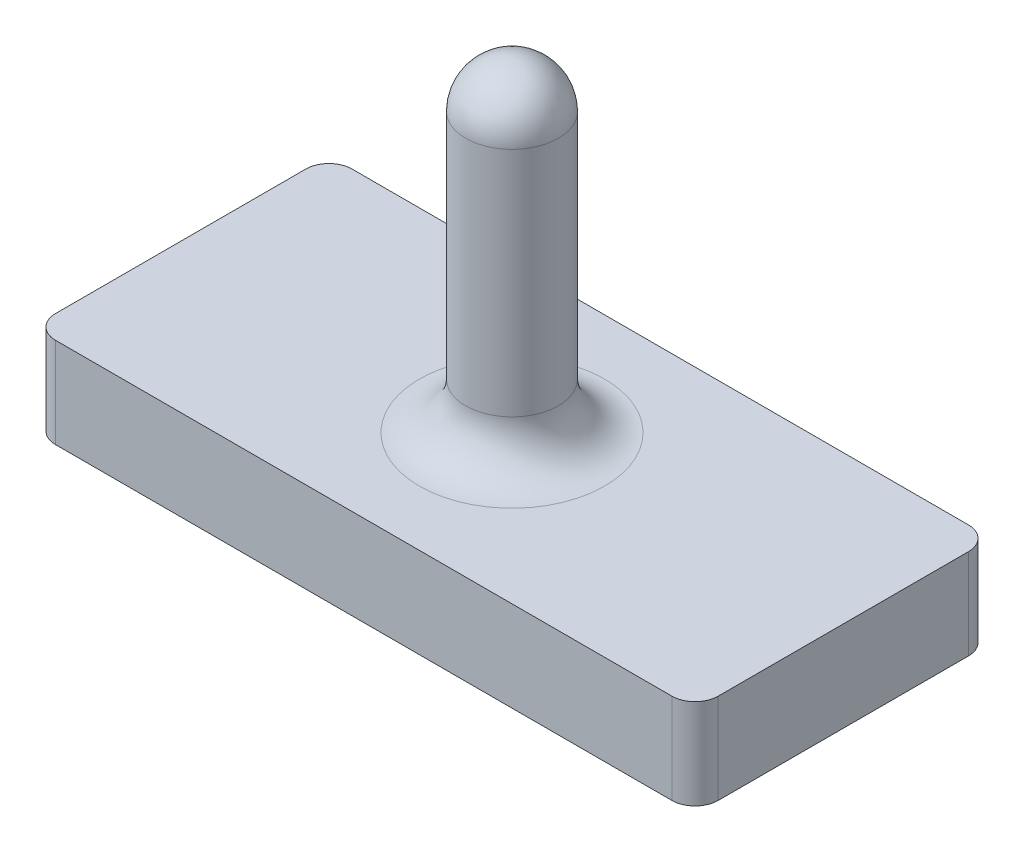
ISO-10303-21;
HEADER;
FILE_DESCRIPTION(('STEP AP214'),'2;1');
FILE_NAME('part.step','',(''),(''),'','','');
FILE_SCHEMA(('AUTOMOTIVE_DESIGN { 1 0 10303 214 1 1 1 1 }'));
ENDSEC;
DATA;
#1=APPLICATION_CONTEXT('core data for automotive mechanical design processes');
#2=APPLICATION_PROTOCOL_DEFINITION('international standard','automotive_design',2000,#1);
#3=PRODUCT_CONTEXT('',#1,'mechanical');
#4=PRODUCT('Part','Part','',(#3));
#5=PRODUCT_RELATED_PRODUCT_CATEGORY('part','',(#4));
#6=PRODUCT_DEFINITION_FORMATION('','',#4);
#7=PRODUCT_DEFINITION_CONTEXT('part definition',#1,'design');
#8=PRODUCT_DEFINITION('design','',#6,#7);
#9=PRODUCT_DEFINITION_SHAPE('','',#8);
#10=(LENGTH_UNIT() NAMED_UNIT(*) SI_UNIT(.MILLI.,.METRE.));
#11=(NAMED_UNIT(*) PLANE_ANGLE_UNIT() SI_UNIT($,.RADIAN.));
#12=(NAMED_UNIT(*) SI_UNIT($,.STERADIAN.) SOLID_ANGLE_UNIT());
#13=UNCERTAINTY_MEASURE_WITH_UNIT(LENGTH_MEASURE(1.E-05),#10,'distance_accuracy_value','');
#14=(GEOMETRIC_REPRESENTATION_CONTEXT(3) GLOBAL_UNCERTAINTY_ASSIGNED_CONTEXT((#13)) GLOBAL_UNIT_ASSIGNED_CONTEXT((#10,
#11,#12)) REPRESENTATION_CONTEXT('',''));
#15=CARTESIAN_POINT('',(0.,0.,0.));
#16=DIRECTION('',(0.,0.,1.));
#17=DIRECTION('',(1.,0.,0.));
#18=AXIS2_PLACEMENT_3D('',#15,#16,#17);
#19=CARTESIAN_POINT('',(0.,4.953,0.));
#20=DIRECTION('',(1.,0.,0.));
#21=DIRECTION('',(0.,0.,-1.));
#22=AXIS2_PLACEMENT_3D('',#19,#20,#21);
#23=PLANE('',#22);
#24=DIRECTION('',(0.,0.,1.));
#25=VECTOR('',#24,1.);
#26=CARTESIAN_POINT('',(0.,4.953,0.));
#27=LINE('',#26,#25);
#28=CARTESIAN_POINT('',(0.,4.953,1.27));
#29=VERTEX_POINT('',#28);
#30=CARTESIAN_POINT('',(0.,4.953,14.986));
#31=VERTEX_POINT('',#30);
#32=EDGE_CURVE('E137',#29,#31,#27,.T.);
#33=ORIENTED_EDGE('',*,*,#32,.F.);
#34=DIRECTION('',(0.,-1.,0.));
#35=VECTOR('',#34,1.);
#36=CARTESIAN_POINT('',(0.,4.953,1.27));
#37=LINE('',#36,#35);
#38=CARTESIAN_POINT('',(0.,0.,1.27));
#39=VERTEX_POINT('',#38);
#40=EDGE_CURVE('E11',#29,#39,#37,.T.);
#41=ORIENTED_EDGE('',*,*,#40,.T.);
#42=DIRECTION('',(0.,0.,1.));
#43=VECTOR('',#42,1.);
#44=CARTESIAN_POINT('',(0.,0.,0.));
#45=LINE('',#44,#43);
#46=CARTESIAN_POINT('',(0.,0.,14.986));
#47=VERTEX_POINT('',#46);
#48=EDGE_CURVE('E195',#39,#47,#45,.T.);
#49=ORIENTED_EDGE('',*,*,#48,.T.);
#50=DIRECTION('',(0.,-1.,0.));
#51=VECTOR('',#50,1.);
#52=CARTESIAN_POINT('',(0.,4.953,14.986));
#53=LINE('',#52,#51);
#54=EDGE_CURVE('E48',#47,#31,#53,.F.);
#55=ORIENTED_EDGE('',*,*,#54,.T.);
#56=EDGE_LOOP('',(#33,#41,#49,#55));
#57=FACE_BOUND('',#56,.T.);
#58=ADVANCED_FACE('F39',(#57),#23,.F.);
#59=CARTESIAN_POINT('',(0.,4.953,16.256));
#60=DIRECTION('',(0.,0.,-1.));
#61=DIRECTION('',(-1.,0.,0.));
#62=AXIS2_PLACEMENT_3D('',#59,#60,#61);
#63=PLANE('',#62);
#64=DIRECTION('',(1.,0.,0.));
#65=VECTOR('',#64,1.);
#66=CARTESIAN_POINT('',(0.,0.,16.256));
#67=LINE('',#66,#65);
#68=CARTESIAN_POINT('',(1.27,0.,16.256));
#69=VERTEX_POINT('',#68);
#70=CARTESIAN_POINT('',(35.052,0.,16.256));
#71=VERTEX_POINT('',#70);
#72=EDGE_CURVE('E144',#69,#71,#67,.T.);
#73=ORIENTED_EDGE('',*,*,#72,.T.);
#74=DIRECTION('',(0.,-1.,0.));
#75=VECTOR('',#74,1.);
#76=CARTESIAN_POINT('',(35.052,4.953,16.256));
#77=LINE('',#76,#75);
#78=CARTESIAN_POINT('',(35.052,4.953,16.256));
#79=VERTEX_POINT('',#78);
#80=EDGE_CURVE('E55',#71,#79,#77,.F.);
#81=ORIENTED_EDGE('',*,*,#80,.T.);
#82=DIRECTION('',(1.,0.,0.));
#83=VECTOR('',#82,1.);
#84=CARTESIAN_POINT('',(0.,4.953,16.256));
#85=LINE('',#84,#83);
#86=CARTESIAN_POINT('',(1.27,4.953,16.256));
#87=VERTEX_POINT('',#86);
#88=EDGE_CURVE('E142',#87,#79,#85,.T.);
#89=ORIENTED_EDGE('',*,*,#88,.F.);
#90=DIRECTION('',(0.,-1.,0.));
#91=VECTOR('',#90,1.);
#92=CARTESIAN_POINT('',(1.27,4.953,16.256));
#93=LINE('',#92,#91);
#94=EDGE_CURVE('E184',#87,#69,#93,.T.);
#95=ORIENTED_EDGE('',*,*,#94,.T.);
#96=EDGE_LOOP('',(#73,#81,#89,#95));
#97=FACE_BOUND('',#96,.T.);
#98=ADVANCED_FACE('F202',(#97),#63,.F.);
#99=CARTESIAN_POINT('',(36.322,4.953,0.));
#100=DIRECTION('',(-1.,0.,0.));
#101=DIRECTION('',(0.,0.,1.));
#102=AXIS2_PLACEMENT_3D('',#99,#100,#101);
#103=PLANE('',#102);
#104=DIRECTION('',(0.,0.,-1.));
#105=VECTOR('',#104,1.);
#106=CARTESIAN_POINT('',(36.322,0.,0.));
#107=LINE('',#106,#105);
#108=CARTESIAN_POINT('',(36.322,0.,14.986));
#109=VERTEX_POINT('',#108);
#110=CARTESIAN_POINT('',(36.322,0.,1.27));
#111=VERTEX_POINT('',#110);
#112=EDGE_CURVE('E138',#109,#111,#107,.T.);
#113=ORIENTED_EDGE('',*,*,#112,.T.);
#114=DIRECTION('',(0.,-1.,0.));
#115=VECTOR('',#114,1.);
#116=CARTESIAN_POINT('',(36.322,4.953,1.27));
#117=LINE('',#116,#115);
#118=CARTESIAN_POINT('',(36.322,4.953,1.27));
#119=VERTEX_POINT('',#118);
#120=EDGE_CURVE('E112',#111,#119,#117,.F.);
#121=ORIENTED_EDGE('',*,*,#120,.T.);
#122=DIRECTION('',(0.,0.,-1.));
#123=VECTOR('',#122,1.);
#124=CARTESIAN_POINT('',(36.322,4.953,0.));
#125=LINE('',#124,#123);
#126=CARTESIAN_POINT('',(36.322,4.953,14.986));
#127=VERTEX_POINT('',#126);
#128=EDGE_CURVE('E209',#127,#119,#125,.T.);
#129=ORIENTED_EDGE('',*,*,#128,.F.);
#130=DIRECTION('',(0.,-1.,0.));
#131=VECTOR('',#130,1.);
#132=CARTESIAN_POINT('',(36.322,4.953,14.986));
#133=LINE('',#132,#131);
#134=EDGE_CURVE('E118',#127,#109,#133,.T.);
#135=ORIENTED_EDGE('',*,*,#134,.T.);
#136=EDGE_LOOP('',(#113,#121,#129,#135));
#137=FACE_BOUND('',#136,.T.);
#138=ADVANCED_FACE('F219',(#137),#103,.F.);
#139=CARTESIAN_POINT('',(0.,4.953,0.));
#140=DIRECTION('',(0.,0.,1.));
#141=DIRECTION('',(1.,0.,0.));
#142=AXIS2_PLACEMENT_3D('',#139,#140,#141);
#143=PLANE('',#142);
#144=DIRECTION('',(-1.,0.,0.));
#145=VECTOR('',#144,1.);
#146=CARTESIAN_POINT('',(0.,4.953,0.));
#147=LINE('',#146,#145);
#148=CARTESIAN_POINT('',(35.052,4.953,0.));
#149=VERTEX_POINT('',#148);
#150=CARTESIAN_POINT('',(1.27,4.953,0.));
#151=VERTEX_POINT('',#150);
#152=EDGE_CURVE('E128',#149,#151,#147,.T.);
#153=ORIENTED_EDGE('',*,*,#152,.F.);
#154=DIRECTION('',(0.,-1.,0.));
#155=VECTOR('',#154,1.);
#156=CARTESIAN_POINT('',(35.052,4.953,0.));
#157=LINE('',#156,#155);
#158=CARTESIAN_POINT('',(35.052,0.,0.));
#159=VERTEX_POINT('',#158);
#160=EDGE_CURVE('E111',#149,#159,#157,.T.);
#161=ORIENTED_EDGE('',*,*,#160,.T.);
#162=DIRECTION('',(-1.,0.,0.));
#163=VECTOR('',#162,1.);
#164=CARTESIAN_POINT('',(0.,0.,0.));
#165=LINE('',#164,#163);
#166=CARTESIAN_POINT('',(1.27,0.,0.));
#167=VERTEX_POINT('',#166);
#168=EDGE_CURVE('E125',#159,#167,#165,.T.);
#169=ORIENTED_EDGE('',*,*,#168,.T.);
#170=DIRECTION('',(0.,-1.,0.));
#171=VECTOR('',#170,1.);
#172=CARTESIAN_POINT('',(1.27,4.953,0.));
#173=LINE('',#172,#171);
#174=EDGE_CURVE('E131',#167,#151,#173,.F.);
#175=ORIENTED_EDGE('',*,*,#174,.T.);
#176=EDGE_LOOP('',(#153,#161,#169,#175));
#177=FACE_BOUND('',#176,.T.);
#178=ADVANCED_FACE('F124',(#177),#143,.F.);
#179=CARTESIAN_POINT('',(0.,4.953,0.));
#180=DIRECTION('',(0.,1.,0.));
#181=DIRECTION('',(0.,0.,1.));
#182=AXIS2_PLACEMENT_3D('',#179,#180,#181);
#183=PLANE('',#182);
#184=CARTESIAN_POINT('',(18.161,4.953,8.128));
#185=DIRECTION('',(0.,1.,0.));
#186=DIRECTION('',(0.,0.,1.));
#187=AXIS2_PLACEMENT_3D('',#184,#185,#186);
#188=CIRCLE('',#187,5.08);
#189=CARTESIAN_POINT('',(18.161,4.953,13.208));
#190=VERTEX_POINT('',#189);
#191=EDGE_CURVE('E156',#190,#190,#188,.F.);
#192=ORIENTED_EDGE('',*,*,#191,.T.);
#193=EDGE_LOOP('',(#192));
#194=FACE_BOUND('',#193,.T.);
#195=ORIENTED_EDGE('',*,*,#128,.T.);
#196=CARTESIAN_POINT('',(35.052,4.953,1.27));
#197=DIRECTION('',(0.,1.,0.));
#198=DIRECTION('',(0.,0.,1.));
#199=AXIS2_PLACEMENT_3D('',#196,#197,#198);
#200=CIRCLE('',#199,1.27);
#201=EDGE_CURVE('E181',#119,#149,#200,.T.);
#202=ORIENTED_EDGE('',*,*,#201,.T.);
#203=ORIENTED_EDGE('',*,*,#152,.T.);
#204=CARTESIAN_POINT('',(1.27,4.953,1.27));
#205=DIRECTION('',(0.,1.,0.));
#206=DIRECTION('',(0.,0.,1.));
#207=AXIS2_PLACEMENT_3D('',#204,#205,#206);
#208=CIRCLE('',#207,1.27);
#209=EDGE_CURVE('E175',#151,#29,#208,.T.);
#210=ORIENTED_EDGE('',*,*,#209,.T.);
#211=ORIENTED_EDGE('',*,*,#32,.T.);
#212=CARTESIAN_POINT('',(1.27,4.953,14.986));
#213=DIRECTION('',(0.,1.,0.));
#214=DIRECTION('',(0.,0.,1.));
#215=AXIS2_PLACEMENT_3D('',#212,#213,#214);
#216=CIRCLE('',#215,1.27);
#217=EDGE_CURVE('E62',#31,#87,#216,.T.);
#218=ORIENTED_EDGE('',*,*,#217,.T.);
#219=ORIENTED_EDGE('',*,*,#88,.T.);
#220=CARTESIAN_POINT('',(35.052,4.953,14.986));
#221=DIRECTION('',(0.,1.,0.));
#222=DIRECTION('',(0.,0.,1.));
#223=AXIS2_PLACEMENT_3D('',#220,#221,#222);
#224=CIRCLE('',#223,1.27);
#225=EDGE_CURVE('E178',#79,#127,#224,.T.);
#226=ORIENTED_EDGE('',*,*,#225,.T.);
#227=EDGE_LOOP('',(#195,#202,#203,#210,#211,#218,#219,#226));
#228=FACE_BOUND('',#227,.T.);
#229=ADVANCED_FACE('F198',(#194,#228),#183,.T.);
#230=CARTESIAN_POINT('',(0.,0.,0.));
#231=DIRECTION('',(0.,1.,0.));
#232=DIRECTION('',(0.,0.,1.));
#233=AXIS2_PLACEMENT_3D('',#230,#231,#232);
#234=PLANE('',#233);
#235=ORIENTED_EDGE('',*,*,#168,.F.);
#236=CARTESIAN_POINT('',(35.052,0.,1.27));
#237=DIRECTION('',(0.,1.,0.));
#238=DIRECTION('',(0.,0.,1.));
#239=AXIS2_PLACEMENT_3D('',#236,#237,#238);
#240=CIRCLE('',#239,1.27);
#241=EDGE_CURVE('E107',#159,#111,#240,.F.);
#242=ORIENTED_EDGE('',*,*,#241,.T.);
#243=ORIENTED_EDGE('',*,*,#112,.F.);
#244=CARTESIAN_POINT('',(35.052,0.,14.986));
#245=DIRECTION('',(0.,1.,0.));
#246=DIRECTION('',(0.,0.,1.));
#247=AXIS2_PLACEMENT_3D('',#244,#245,#246);
#248=CIRCLE('',#247,1.27);
#249=EDGE_CURVE('E119',#109,#71,#248,.F.);
#250=ORIENTED_EDGE('',*,*,#249,.T.);
#251=ORIENTED_EDGE('',*,*,#72,.F.);
#252=CARTESIAN_POINT('',(1.27,0.,14.986));
#253=DIRECTION('',(0.,1.,0.));
#254=DIRECTION('',(0.,0.,1.));
#255=AXIS2_PLACEMENT_3D('',#252,#253,#254);
#256=CIRCLE('',#255,1.27);
#257=EDGE_CURVE('E130',#69,#47,#256,.F.);
#258=ORIENTED_EDGE('',*,*,#257,.T.);
#259=ORIENTED_EDGE('',*,*,#48,.F.);
#260=CARTESIAN_POINT('',(1.27,0.,1.27));
#261=DIRECTION('',(0.,1.,0.));
#262=DIRECTION('',(0.,0.,1.));
#263=AXIS2_PLACEMENT_3D('',#260,#261,#262);
#264=CIRCLE('',#263,1.27);
#265=EDGE_CURVE('E135',#39,#167,#264,.F.);
#266=ORIENTED_EDGE('',*,*,#265,.T.);
#267=EDGE_LOOP('',(#235,#242,#243,#250,#251,#258,#259,#266));
#268=FACE_BOUND('',#267,.T.);
#269=ADVANCED_FACE('F133',(#268),#234,.F.);
#270=CARTESIAN_POINT('',(18.161,22.733,8.128));
#271=DIRECTION('',(0.,-1.,0.));
#272=DIRECTION('',(0.,0.,-1.));
#273=AXIS2_PLACEMENT_3D('',#270,#271,#272);
#274=CYLINDRICAL_SURFACE('',#273,2.54);
#275=CARTESIAN_POINT('',(18.161,7.493,8.128));
#276=DIRECTION('',(0.,1.,0.));
#277=DIRECTION('',(0.,0.,1.));
#278=AXIS2_PLACEMENT_3D('',#275,#276,#277);
#279=CIRCLE('',#278,2.54);
#280=CARTESIAN_POINT('',(18.161,7.493,10.668));
#281=VERTEX_POINT('',#280);
#282=EDGE_CURVE('E152',#281,#281,#279,.T.);
#283=ORIENTED_EDGE('',*,*,#282,.T.);
#284=EDGE_LOOP('',(#283));
#285=FACE_BOUND('',#284,.T.);
#286=CARTESIAN_POINT('',(18.161,20.193,8.128));
#287=DIRECTION('',(0.,-1.,0.));
#288=DIRECTION('',(0.,0.,-1.));
#289=AXIS2_PLACEMENT_3D('',#286,#287,#288);
#290=CIRCLE('',#289,2.54);
#291=CARTESIAN_POINT('',(18.161,20.193,5.588));
#292=VERTEX_POINT('',#291);
#293=EDGE_CURVE('E148',#292,#292,#290,.T.);
#294=ORIENTED_EDGE('',*,*,#293,.T.);
#295=EDGE_LOOP('',(#294));
#296=FACE_BOUND('',#295,.T.);
#297=ADVANCED_FACE('F240',(#285,#296),#274,.T.);
#298=CARTESIAN_POINT('',(18.161,20.193,8.128));
#299=DIRECTION('',(0.,1.,0.));
#300=DIRECTION('',(0.,0.,1.));
#301=AXIS2_PLACEMENT_3D('',#298,#299,#300);
#302=SPHERICAL_SURFACE('',#301,2.54);
#303=ORIENTED_EDGE('',*,*,#293,.F.);
#304=EDGE_LOOP('',(#303));
#305=FACE_BOUND('',#304,.T.);
#306=ADVANCED_FACE('F236',(#305),#302,.T.);
#307=CARTESIAN_POINT('',(18.161,7.493,8.128));
#308=DIRECTION('',(0.,1.,0.));
#309=DIRECTION('',(0.,0.,1.));
#310=AXIS2_PLACEMENT_3D('',#307,#308,#309);
#311=TOROIDAL_SURFACE('',#310,5.08,2.54);
#312=ORIENTED_EDGE('',*,*,#191,.F.);
#313=EDGE_LOOP('',(#312));
#314=FACE_BOUND('',#313,.T.);
#315=ORIENTED_EDGE('',*,*,#282,.F.);
#316=EDGE_LOOP('',(#315));
#317=FACE_BOUND('',#316,.T.);
#318=ADVANCED_FACE('F239',(#314,#317),#311,.F.);
#319=CARTESIAN_POINT('',(35.052,4.953,1.27));
#320=DIRECTION('',(0.,-1.,0.));
#321=DIRECTION('',(0.,0.,-1.));
#322=AXIS2_PLACEMENT_3D('',#319,#320,#321);
#323=CYLINDRICAL_SURFACE('',#322,1.27);
#324=ORIENTED_EDGE('',*,*,#201,.F.);
#325=ORIENTED_EDGE('',*,*,#120,.F.);
#326=ORIENTED_EDGE('',*,*,#241,.F.);
#327=ORIENTED_EDGE('',*,*,#160,.F.);
#328=EDGE_LOOP('',(#324,#325,#326,#327));
#329=FACE_BOUND('',#328,.T.);
#330=ADVANCED_FACE('F110',(#329),#323,.T.);
#331=CARTESIAN_POINT('',(35.052,4.953,14.986));
#332=DIRECTION('',(0.,-1.,0.));
#333=DIRECTION('',(0.,0.,-1.));
#334=AXIS2_PLACEMENT_3D('',#331,#332,#333);
#335=CYLINDRICAL_SURFACE('',#334,1.27);
#336=ORIENTED_EDGE('',*,*,#225,.F.);
#337=ORIENTED_EDGE('',*,*,#80,.F.);
#338=ORIENTED_EDGE('',*,*,#249,.F.);
#339=ORIENTED_EDGE('',*,*,#134,.F.);
#340=EDGE_LOOP('',(#336,#337,#338,#339));
#341=FACE_BOUND('',#340,.T.);
#342=ADVANCED_FACE('F217',(#341),#335,.T.);
#343=CARTESIAN_POINT('',(1.27,4.953,1.27));
#344=DIRECTION('',(0.,-1.,0.));
#345=DIRECTION('',(0.,0.,-1.));
#346=AXIS2_PLACEMENT_3D('',#343,#344,#345);
#347=CYLINDRICAL_SURFACE('',#346,1.27);
#348=ORIENTED_EDGE('',*,*,#209,.F.);
#349=ORIENTED_EDGE('',*,*,#174,.F.);
#350=ORIENTED_EDGE('',*,*,#265,.F.);
#351=ORIENTED_EDGE('',*,*,#40,.F.);
#352=EDGE_LOOP('',(#348,#349,#350,#351));
#353=FACE_BOUND('',#352,.T.);
#354=ADVANCED_FACE('F221',(#353),#347,.T.);
#355=CARTESIAN_POINT('',(1.27,4.953,14.986));
#356=DIRECTION('',(0.,-1.,0.));
#357=DIRECTION('',(0.,0.,-1.));
#358=AXIS2_PLACEMENT_3D('',#355,#356,#357);
#359=CYLINDRICAL_SURFACE('',#358,1.27);
#360=ORIENTED_EDGE('',*,*,#217,.F.);
#361=ORIENTED_EDGE('',*,*,#54,.F.);
#362=ORIENTED_EDGE('',*,*,#257,.F.);
#363=ORIENTED_EDGE('',*,*,#94,.F.);
#364=EDGE_LOOP('',(#360,#361,#362,#363));
#365=FACE_BOUND('',#364,.T.);
#366=ADVANCED_FACE('F41',(#365),#359,.T.);
#367=CLOSED_SHELL('',(#58,#98,#138,#178,#229,#269,#297,#306,#318,#330,#342,#354,#366));
#368=MANIFOLD_SOLID_BREP('B2',#367);
#369=ADVANCED_BREP_SHAPE_REPRESENTATION('',(#18,#368),#14);
#370=SHAPE_DEFINITION_REPRESENTATION(#9,#369);
ENDSEC;
END-ISO-10303-21;
